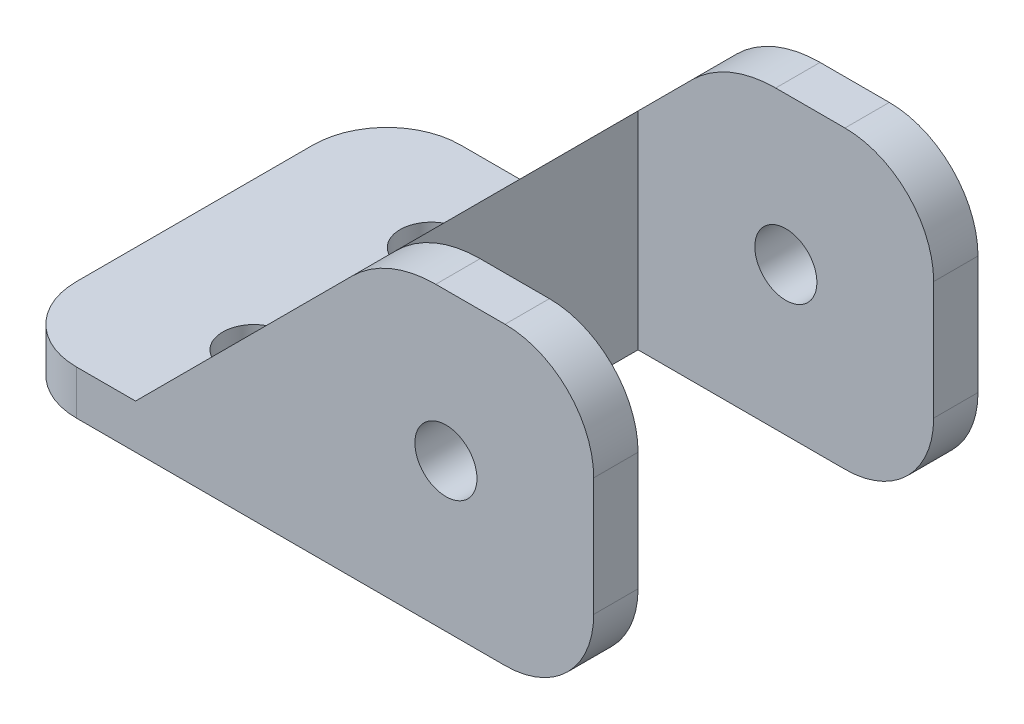
ISO-10303-21;
HEADER;
FILE_DESCRIPTION(('STEP AP214'),'2;1');
FILE_NAME('part.step','',(''),(''),'','','');
FILE_SCHEMA(('AUTOMOTIVE_DESIGN { 1 0 10303 214 1 1 1 1 }'));
ENDSEC;
DATA;
#1=APPLICATION_CONTEXT('core data for automotive mechanical design processes');
#2=APPLICATION_PROTOCOL_DEFINITION('international standard','automotive_design',2000,#1);
#3=PRODUCT_CONTEXT('',#1,'mechanical');
#4=PRODUCT('Part','Part','',(#3));
#5=PRODUCT_RELATED_PRODUCT_CATEGORY('part','',(#4));
#6=PRODUCT_DEFINITION_FORMATION('','',#4);
#7=PRODUCT_DEFINITION_CONTEXT('part definition',#1,'design');
#8=PRODUCT_DEFINITION('design','',#6,#7);
#9=PRODUCT_DEFINITION_SHAPE('','',#8);
#10=(LENGTH_UNIT() NAMED_UNIT(*) SI_UNIT(.MILLI.,.METRE.));
#11=(NAMED_UNIT(*) PLANE_ANGLE_UNIT() SI_UNIT($,.RADIAN.));
#12=(NAMED_UNIT(*) SI_UNIT($,.STERADIAN.) SOLID_ANGLE_UNIT());
#13=UNCERTAINTY_MEASURE_WITH_UNIT(LENGTH_MEASURE(1.E-05),#10,'distance_accuracy_value','');
#14=(GEOMETRIC_REPRESENTATION_CONTEXT(3) GLOBAL_UNCERTAINTY_ASSIGNED_CONTEXT((#13)) GLOBAL_UNIT_ASSIGNED_CONTEXT((#10,
#11,#12)) REPRESENTATION_CONTEXT('',''));
#15=CARTESIAN_POINT('',(0.,0.,0.));
#16=DIRECTION('',(0.,0.,1.));
#17=DIRECTION('',(1.,0.,0.));
#18=AXIS2_PLACEMENT_3D('',#15,#16,#17);
#19=CARTESIAN_POINT('',(6.00000000000001,20.,0.));
#20=DIRECTION('',(-0.707106781186549,0.707106781186546,0.));
#21=DIRECTION('',(0.,0.,-1.));
#22=AXIS2_PLACEMENT_3D('',#19,#20,#21);
#23=PLANE('',#22);
#24=DIRECTION('',(0.,0.,-1.));
#25=VECTOR('',#24,1.);
#26=CARTESIAN_POINT('',(-11.0000000000001,3.,0.));
#27=LINE('',#26,#25);
#28=CARTESIAN_POINT('',(-11.0000000000001,3.,-22.8729833462074));
#29=VERTEX_POINT('',#28);
#30=CARTESIAN_POINT('',(-11.0000000000001,3.,-26.));
#31=VERTEX_POINT('',#30);
#32=EDGE_CURVE('E203',#29,#31,#27,.T.);
#33=ORIENTED_EDGE('',*,*,#32,.F.);
#34=CARTESIAN_POINT('',(-10.,3.99999999999994,-19.));
#35=DIRECTION('',(-0.707106781186549,0.707106781186546,0.));
#36=DIRECTION('',(-0.707106781186546,-0.707106781186549,0.));
#37=AXIS2_PLACEMENT_3D('',#34,#35,#36);
#38=ELLIPSE('',#37,5.65685424949239,4.);
#39=CARTESIAN_POINT('',(-10.9999999999999,3.,-15.1270166537926));
#40=VERTEX_POINT('',#39);
#41=EDGE_CURVE('E11',#29,#40,#38,.F.);
#42=ORIENTED_EDGE('',*,*,#41,.T.);
#43=CARTESIAN_POINT('',(-11.0000000000001,3.,-10.8729833462074));
#44=VERTEX_POINT('',#43);
#45=EDGE_CURVE('E194',#44,#40,#27,.T.);
#46=ORIENTED_EDGE('',*,*,#45,.F.);
#47=CARTESIAN_POINT('',(-10.,3.99999999999994,-7.));
#48=DIRECTION('',(-0.707106781186549,0.707106781186546,0.));
#49=DIRECTION('',(-0.707106781186546,-0.707106781186549,0.));
#50=AXIS2_PLACEMENT_3D('',#47,#48,#49);
#51=ELLIPSE('',#50,5.65685424949239,4.);
#52=CARTESIAN_POINT('',(-10.9999999999999,3.,-3.12701665379257));
#53=VERTEX_POINT('',#52);
#54=EDGE_CURVE('E53',#44,#53,#51,.F.);
#55=ORIENTED_EDGE('',*,*,#54,.T.);
#56=CARTESIAN_POINT('',(-11.0000000000001,3.,0.));
#57=VERTEX_POINT('',#56);
#58=EDGE_CURVE('E193',#57,#53,#27,.T.);
#59=ORIENTED_EDGE('',*,*,#58,.F.);
#60=DIRECTION('',(-0.707106781186546,-0.707106781186549,0.));
#61=VECTOR('',#60,1.);
#62=CARTESIAN_POINT('',(6.00000000000001,20.,0.));
#63=LINE('',#62,#61);
#64=CARTESIAN_POINT('',(3.65685424949238,17.6568542494924,0.));
#65=VERTEX_POINT('',#64);
#66=EDGE_CURVE('E255',#65,#57,#63,.T.);
#67=ORIENTED_EDGE('',*,*,#66,.F.);
#68=DIRECTION('',(0.,0.,1.));
#69=VECTOR('',#68,1.);
#70=CARTESIAN_POINT('',(3.65685424949238,17.6568542494924,0.));
#71=LINE('',#70,#69);
#72=CARTESIAN_POINT('',(3.65685424949238,17.6568542494924,-3.));
#73=VERTEX_POINT('',#72);
#74=EDGE_CURVE('E239',#65,#73,#71,.F.);
#75=ORIENTED_EDGE('',*,*,#74,.T.);
#76=DIRECTION('',(0.707106781186546,0.707106781186549,0.));
#77=VECTOR('',#76,1.);
#78=CARTESIAN_POINT('',(6.00000000000001,20.,-3.));
#79=LINE('',#78,#77);
#80=CARTESIAN_POINT('',(0.,14.,-3.));
#81=VERTEX_POINT('',#80);
#82=EDGE_CURVE('E252',#81,#73,#79,.T.);
#83=ORIENTED_EDGE('',*,*,#82,.F.);
#84=DIRECTION('',(0.,0.,-1.));
#85=VECTOR('',#84,1.);
#86=CARTESIAN_POINT('',(0.,14.,0.));
#87=LINE('',#86,#85);
#88=CARTESIAN_POINT('',(0.,14.,-23.));
#89=VERTEX_POINT('',#88);
#90=EDGE_CURVE('E201',#81,#89,#87,.T.);
#91=ORIENTED_EDGE('',*,*,#90,.T.);
#92=DIRECTION('',(0.707106781186546,0.707106781186549,0.));
#93=VECTOR('',#92,1.);
#94=CARTESIAN_POINT('',(6.,20.,-23.));
#95=LINE('',#94,#93);
#96=CARTESIAN_POINT('',(3.65685424949238,17.6568542494924,-23.));
#97=VERTEX_POINT('',#96);
#98=EDGE_CURVE('E249',#97,#89,#95,.F.);
#99=ORIENTED_EDGE('',*,*,#98,.F.);
#100=DIRECTION('',(0.,0.,1.));
#101=VECTOR('',#100,1.);
#102=CARTESIAN_POINT('',(3.65685424949238,17.6568542494924,-26.));
#103=LINE('',#102,#101);
#104=CARTESIAN_POINT('',(3.65685424949238,17.6568542494924,-26.));
#105=VERTEX_POINT('',#104);
#106=EDGE_CURVE('E230',#97,#105,#103,.F.);
#107=ORIENTED_EDGE('',*,*,#106,.T.);
#108=DIRECTION('',(-0.707106781186546,-0.707106781186549,0.));
#109=VECTOR('',#108,1.);
#110=CARTESIAN_POINT('',(6.,20.,-26.));
#111=LINE('',#110,#109);
#112=EDGE_CURVE('E246',#31,#105,#111,.F.);
#113=ORIENTED_EDGE('',*,*,#112,.F.);
#114=EDGE_LOOP('',(#33,#42,#46,#55,#59,#67,#75,#83,#91,#99,#107,#113));
#115=FACE_BOUND('',#114,.T.);
#116=ADVANCED_FACE('F45',(#115),#23,.T.);
#117=CARTESIAN_POINT('',(0.,3.,0.));
#118=DIRECTION('',(-1.,0.,0.));
#119=DIRECTION('',(0.,0.,1.));
#120=AXIS2_PLACEMENT_3D('',#117,#118,#119);
#121=PLANE('',#120);
#122=DIRECTION('',(0.,-1.,0.));
#123=VECTOR('',#122,1.);
#124=CARTESIAN_POINT('',(0.,20.,-3.));
#125=LINE('',#124,#123);
#126=CARTESIAN_POINT('',(0.,0.,-3.));
#127=VERTEX_POINT('',#126);
#128=EDGE_CURVE('E364',#81,#127,#125,.T.);
#129=ORIENTED_EDGE('',*,*,#128,.T.);
#130=DIRECTION('',(0.,0.,-1.));
#131=VECTOR('',#130,1.);
#132=CARTESIAN_POINT('',(0.,0.,0.));
#133=LINE('',#132,#131);
#134=CARTESIAN_POINT('',(0.,0.,-23.));
#135=VERTEX_POINT('',#134);
#136=EDGE_CURVE('E320',#127,#135,#133,.T.);
#137=ORIENTED_EDGE('',*,*,#136,.T.);
#138=DIRECTION('',(0.,-1.,0.));
#139=VECTOR('',#138,1.);
#140=CARTESIAN_POINT('',(0.,20.,-23.));
#141=LINE('',#140,#139);
#142=EDGE_CURVE('E295',#89,#135,#141,.T.);
#143=ORIENTED_EDGE('',*,*,#142,.F.);
#144=ORIENTED_EDGE('',*,*,#90,.F.);
#145=EDGE_LOOP('',(#129,#137,#143,#144));
#146=FACE_BOUND('',#145,.T.);
#147=ADVANCED_FACE('F393',(#146),#121,.F.);
#148=CARTESIAN_POINT('',(-15.,3.,-21.));
#149=DIRECTION('',(0.,1.,0.));
#150=DIRECTION('',(0.,0.,1.));
#151=AXIS2_PLACEMENT_3D('',#148,#149,#150);
#152=PLANE('',#151);
#153=ORIENTED_EDGE('',*,*,#45,.T.);
#154=CARTESIAN_POINT('',(-10.,3.,-19.));
#155=DIRECTION('',(0.,1.,0.));
#156=DIRECTION('',(0.,0.,1.));
#157=AXIS2_PLACEMENT_3D('',#154,#155,#156);
#158=CIRCLE('',#157,4.);
#159=EDGE_CURVE('E66',#40,#29,#158,.T.);
#160=ORIENTED_EDGE('',*,*,#159,.T.);
#161=ORIENTED_EDGE('',*,*,#32,.T.);
#162=DIRECTION('',(-1.,0.,0.));
#163=VECTOR('',#162,1.);
#164=CARTESIAN_POINT('',(0.,3.,-26.));
#165=LINE('',#164,#163);
#166=CARTESIAN_POINT('',(-15.,3.,-26.));
#167=VERTEX_POINT('',#166);
#168=EDGE_CURVE('E311',#31,#167,#165,.T.);
#169=ORIENTED_EDGE('',*,*,#168,.T.);
#170=CARTESIAN_POINT('',(-15.,3.,-21.));
#171=DIRECTION('',(0.,1.,0.));
#172=DIRECTION('',(0.,0.,1.));
#173=AXIS2_PLACEMENT_3D('',#170,#171,#172);
#174=CIRCLE('',#173,5.);
#175=CARTESIAN_POINT('',(-20.,3.,-21.));
#176=VERTEX_POINT('',#175);
#177=EDGE_CURVE('E328',#167,#176,#174,.T.);
#178=ORIENTED_EDGE('',*,*,#177,.T.);
#179=DIRECTION('',(0.,0.,1.));
#180=VECTOR('',#179,1.);
#181=CARTESIAN_POINT('',(-20.,3.,-5.00000000000003));
#182=LINE('',#181,#180);
#183=CARTESIAN_POINT('',(-20.,3.,-5.00000000000003));
#184=VERTEX_POINT('',#183);
#185=EDGE_CURVE('E326',#176,#184,#182,.T.);
#186=ORIENTED_EDGE('',*,*,#185,.T.);
#187=CARTESIAN_POINT('',(-15.,3.,-5.));
#188=DIRECTION('',(0.,1.,0.));
#189=DIRECTION('',(0.,0.,-1.));
#190=AXIS2_PLACEMENT_3D('',#187,#188,#189);
#191=CIRCLE('',#190,5.);
#192=CARTESIAN_POINT('',(-15.,3.,0.));
#193=VERTEX_POINT('',#192);
#194=EDGE_CURVE('E324',#184,#193,#191,.T.);
#195=ORIENTED_EDGE('',*,*,#194,.T.);
#196=DIRECTION('',(1.,0.,0.));
#197=VECTOR('',#196,1.);
#198=CARTESIAN_POINT('',(0.,3.,0.));
#199=LINE('',#198,#197);
#200=EDGE_CURVE('E200',#193,#57,#199,.T.);
#201=ORIENTED_EDGE('',*,*,#200,.T.);
#202=ORIENTED_EDGE('',*,*,#58,.T.);
#203=CARTESIAN_POINT('',(-10.,3.,-7.));
#204=DIRECTION('',(0.,1.,0.));
#205=DIRECTION('',(0.,0.,1.));
#206=AXIS2_PLACEMENT_3D('',#203,#204,#205);
#207=CIRCLE('',#206,4.);
#208=EDGE_CURVE('E60',#53,#44,#207,.T.);
#209=ORIENTED_EDGE('',*,*,#208,.T.);
#210=EDGE_LOOP('',(#153,#160,#161,#169,#178,#186,#195,#201,#202,#209));
#211=FACE_BOUND('',#210,.T.);
#212=CARTESIAN_POINT('',(-10.,3.,-7.));
#213=DIRECTION('',(0.,1.,0.));
#214=DIRECTION('',(0.,0.,1.));
#215=AXIS2_PLACEMENT_3D('',#212,#213,#214);
#216=CIRCLE('',#215,2.1);
#217=CARTESIAN_POINT('',(-10.,3.,-4.9));
#218=VERTEX_POINT('',#217);
#219=EDGE_CURVE('E334',#218,#218,#216,.T.);
#220=ORIENTED_EDGE('',*,*,#219,.F.);
#221=EDGE_LOOP('',(#220));
#222=FACE_BOUND('',#221,.T.);
#223=CARTESIAN_POINT('',(-10.,3.,-19.));
#224=DIRECTION('',(0.,1.,0.));
#225=DIRECTION('',(0.,0.,1.));
#226=AXIS2_PLACEMENT_3D('',#223,#224,#225);
#227=CIRCLE('',#226,2.1);
#228=CARTESIAN_POINT('',(-10.,3.,-16.9));
#229=VERTEX_POINT('',#228);
#230=EDGE_CURVE('E322',#229,#229,#227,.T.);
#231=ORIENTED_EDGE('',*,*,#230,.F.);
#232=EDGE_LOOP('',(#231));
#233=FACE_BOUND('',#232,.T.);
#234=ADVANCED_FACE('F197',(#211,#222,#233),#152,.T.);
#235=CARTESIAN_POINT('',(-15.,0.,-21.));
#236=DIRECTION('',(0.,1.,0.));
#237=DIRECTION('',(0.,0.,1.));
#238=AXIS2_PLACEMENT_3D('',#235,#236,#237);
#239=PLANE('',#238);
#240=DIRECTION('',(-1.,0.,0.));
#241=VECTOR('',#240,1.);
#242=CARTESIAN_POINT('',(20.,0.,-3.));
#243=LINE('',#242,#241);
#244=CARTESIAN_POINT('',(14.,0.,-3.));
#245=VERTEX_POINT('',#244);
#246=EDGE_CURVE('E355',#245,#127,#243,.T.);
#247=ORIENTED_EDGE('',*,*,#246,.F.);
#248=DIRECTION('',(0.,0.,-1.));
#249=VECTOR('',#248,1.);
#250=CARTESIAN_POINT('',(14.,0.,-21.));
#251=LINE('',#250,#249);
#252=CARTESIAN_POINT('',(14.,0.,0.));
#253=VERTEX_POINT('',#252);
#254=EDGE_CURVE('E274',#245,#253,#251,.F.);
#255=ORIENTED_EDGE('',*,*,#254,.T.);
#256=DIRECTION('',(1.,0.,0.));
#257=VECTOR('',#256,1.);
#258=CARTESIAN_POINT('',(0.,0.,0.));
#259=LINE('',#258,#257);
#260=CARTESIAN_POINT('',(-15.,0.,0.));
#261=VERTEX_POINT('',#260);
#262=EDGE_CURVE('E308',#261,#253,#259,.T.);
#263=ORIENTED_EDGE('',*,*,#262,.F.);
#264=CARTESIAN_POINT('',(-15.,0.,-5.));
#265=DIRECTION('',(0.,1.,0.));
#266=DIRECTION('',(0.,0.,-1.));
#267=AXIS2_PLACEMENT_3D('',#264,#265,#266);
#268=CIRCLE('',#267,5.);
#269=CARTESIAN_POINT('',(-20.,0.,-5.00000000000003));
#270=VERTEX_POINT('',#269);
#271=EDGE_CURVE('E312',#270,#261,#268,.T.);
#272=ORIENTED_EDGE('',*,*,#271,.F.);
#273=DIRECTION('',(0.,0.,1.));
#274=VECTOR('',#273,1.);
#275=CARTESIAN_POINT('',(-20.,0.,-5.00000000000003));
#276=LINE('',#275,#274);
#277=CARTESIAN_POINT('',(-20.,0.,-21.));
#278=VERTEX_POINT('',#277);
#279=EDGE_CURVE('E314',#278,#270,#276,.T.);
#280=ORIENTED_EDGE('',*,*,#279,.F.);
#281=CARTESIAN_POINT('',(-15.,0.,-21.));
#282=DIRECTION('',(0.,1.,0.));
#283=DIRECTION('',(0.,0.,1.));
#284=AXIS2_PLACEMENT_3D('',#281,#282,#283);
#285=CIRCLE('',#284,5.);
#286=CARTESIAN_POINT('',(-15.,0.,-26.));
#287=VERTEX_POINT('',#286);
#288=EDGE_CURVE('E316',#287,#278,#285,.T.);
#289=ORIENTED_EDGE('',*,*,#288,.F.);
#290=DIRECTION('',(-1.,0.,0.));
#291=VECTOR('',#290,1.);
#292=CARTESIAN_POINT('',(0.,0.,-26.));
#293=LINE('',#292,#291);
#294=CARTESIAN_POINT('',(14.,0.,-26.));
#295=VERTEX_POINT('',#294);
#296=EDGE_CURVE('E318',#295,#287,#293,.T.);
#297=ORIENTED_EDGE('',*,*,#296,.F.);
#298=DIRECTION('',(0.,0.,-1.));
#299=VECTOR('',#298,1.);
#300=CARTESIAN_POINT('',(14.,0.,-21.));
#301=LINE('',#300,#299);
#302=CARTESIAN_POINT('',(14.,0.,-23.));
#303=VERTEX_POINT('',#302);
#304=EDGE_CURVE('E276',#295,#303,#301,.F.);
#305=ORIENTED_EDGE('',*,*,#304,.T.);
#306=DIRECTION('',(1.,0.,0.));
#307=VECTOR('',#306,1.);
#308=CARTESIAN_POINT('',(20.,0.,-23.));
#309=LINE('',#308,#307);
#310=EDGE_CURVE('E351',#135,#303,#309,.T.);
#311=ORIENTED_EDGE('',*,*,#310,.F.);
#312=ORIENTED_EDGE('',*,*,#136,.F.);
#313=EDGE_LOOP('',(#247,#255,#263,#272,#280,#289,#297,#305,#311,#312));
#314=FACE_BOUND('',#313,.T.);
#315=CARTESIAN_POINT('',(-10.,0.,-19.));
#316=DIRECTION('',(0.,1.,0.));
#317=DIRECTION('',(0.,0.,1.));
#318=AXIS2_PLACEMENT_3D('',#315,#316,#317);
#319=CIRCLE('',#318,2.1);
#320=CARTESIAN_POINT('',(-10.,0.,-16.9));
#321=VERTEX_POINT('',#320);
#322=EDGE_CURVE('E331',#321,#321,#319,.T.);
#323=ORIENTED_EDGE('',*,*,#322,.T.);
#324=EDGE_LOOP('',(#323));
#325=FACE_BOUND('',#324,.T.);
#326=CARTESIAN_POINT('',(-10.,0.,-7.));
#327=DIRECTION('',(0.,1.,0.));
#328=DIRECTION('',(0.,0.,1.));
#329=AXIS2_PLACEMENT_3D('',#326,#327,#328);
#330=CIRCLE('',#329,2.1);
#331=CARTESIAN_POINT('',(-10.,0.,-4.9));
#332=VERTEX_POINT('',#331);
#333=EDGE_CURVE('E337',#332,#332,#330,.T.);
#334=ORIENTED_EDGE('',*,*,#333,.T.);
#335=EDGE_LOOP('',(#334));
#336=FACE_BOUND('',#335,.T.);
#337=ADVANCED_FACE('F388',(#314,#325,#336),#239,.F.);
#338=CARTESIAN_POINT('',(0.,3.,-26.));
#339=DIRECTION('',(0.,0.,1.));
#340=DIRECTION('',(1.,0.,0.));
#341=AXIS2_PLACEMENT_3D('',#338,#339,#340);
#342=PLANE('',#341);
#343=CARTESIAN_POINT('',(10.,10.,-26.));
#344=DIRECTION('',(0.,0.,1.));
#345=DIRECTION('',(1.,0.,0.));
#346=AXIS2_PLACEMENT_3D('',#343,#344,#345);
#347=CIRCLE('',#346,2.1);
#348=CARTESIAN_POINT('',(12.1,10.,-26.));
#349=VERTEX_POINT('',#348);
#350=EDGE_CURVE('E208',#349,#349,#347,.T.);
#351=ORIENTED_EDGE('',*,*,#350,.T.);
#352=EDGE_LOOP('',(#351));
#353=FACE_BOUND('',#352,.T.);
#354=ORIENTED_EDGE('',*,*,#168,.F.);
#355=ORIENTED_EDGE('',*,*,#112,.T.);
#356=CARTESIAN_POINT('',(9.31370849898478,12.,-26.));
#357=DIRECTION('',(0.,0.,1.));
#358=DIRECTION('',(1.,0.,0.));
#359=AXIS2_PLACEMENT_3D('',#356,#357,#358);
#360=CIRCLE('',#359,8.);
#361=CARTESIAN_POINT('',(9.31370849898478,20.,-26.));
#362=VERTEX_POINT('',#361);
#363=EDGE_CURVE('E195',#105,#362,#360,.F.);
#364=ORIENTED_EDGE('',*,*,#363,.T.);
#365=DIRECTION('',(-1.,0.,0.));
#366=VECTOR('',#365,1.);
#367=CARTESIAN_POINT('',(0.,20.,-26.));
#368=LINE('',#367,#366);
#369=CARTESIAN_POINT('',(14.,20.,-26.));
#370=VERTEX_POINT('',#369);
#371=EDGE_CURVE('E350',#370,#362,#368,.T.);
#372=ORIENTED_EDGE('',*,*,#371,.F.);
#373=CARTESIAN_POINT('',(14.,14.,-26.));
#374=DIRECTION('',(0.,0.,1.));
#375=DIRECTION('',(1.,0.,0.));
#376=AXIS2_PLACEMENT_3D('',#373,#374,#375);
#377=CIRCLE('',#376,6.);
#378=CARTESIAN_POINT('',(20.,14.,-26.));
#379=VERTEX_POINT('',#378);
#380=EDGE_CURVE('E267',#370,#379,#377,.F.);
#381=ORIENTED_EDGE('',*,*,#380,.T.);
#382=DIRECTION('',(0.,-1.,0.));
#383=VECTOR('',#382,1.);
#384=CARTESIAN_POINT('',(20.,20.,-26.));
#385=LINE('',#384,#383);
#386=CARTESIAN_POINT('',(20.,6.,-26.));
#387=VERTEX_POINT('',#386);
#388=EDGE_CURVE('E347',#379,#387,#385,.T.);
#389=ORIENTED_EDGE('',*,*,#388,.T.);
#390=CARTESIAN_POINT('',(14.,6.,-26.));
#391=DIRECTION('',(0.,0.,1.));
#392=DIRECTION('',(1.,0.,0.));
#393=AXIS2_PLACEMENT_3D('',#390,#391,#392);
#394=CIRCLE('',#393,6.);
#395=EDGE_CURVE('E269',#387,#295,#394,.F.);
#396=ORIENTED_EDGE('',*,*,#395,.T.);
#397=ORIENTED_EDGE('',*,*,#296,.T.);
#398=DIRECTION('',(0.,-1.,0.));
#399=VECTOR('',#398,1.);
#400=CARTESIAN_POINT('',(-15.,3.,-26.));
#401=LINE('',#400,#399);
#402=EDGE_CURVE('E296',#167,#287,#401,.T.);
#403=ORIENTED_EDGE('',*,*,#402,.F.);
#404=EDGE_LOOP('',(#354,#355,#364,#372,#381,#389,#396,#397,#403));
#405=FACE_BOUND('',#404,.T.);
#406=ADVANCED_FACE('F464',(#353,#405),#342,.F.);
#407=CARTESIAN_POINT('',(-15.,3.,-21.));
#408=DIRECTION('',(0.,-1.,0.));
#409=DIRECTION('',(0.,0.,-1.));
#410=AXIS2_PLACEMENT_3D('',#407,#408,#409);
#411=CYLINDRICAL_SURFACE('',#410,5.);
#412=ORIENTED_EDGE('',*,*,#288,.T.);
#413=DIRECTION('',(0.,-1.,0.));
#414=VECTOR('',#413,1.);
#415=CARTESIAN_POINT('',(-20.,3.,-21.));
#416=LINE('',#415,#414);
#417=EDGE_CURVE('E299',#176,#278,#416,.T.);
#418=ORIENTED_EDGE('',*,*,#417,.F.);
#419=ORIENTED_EDGE('',*,*,#177,.F.);
#420=ORIENTED_EDGE('',*,*,#402,.T.);
#421=EDGE_LOOP('',(#412,#418,#419,#420));
#422=FACE_BOUND('',#421,.T.);
#423=ADVANCED_FACE('F471',(#422),#411,.T.);
#424=CARTESIAN_POINT('',(-20.,3.,-5.00000000000003));
#425=DIRECTION('',(1.,0.,0.));
#426=DIRECTION('',(0.,0.,-1.));
#427=AXIS2_PLACEMENT_3D('',#424,#425,#426);
#428=PLANE('',#427);
#429=ORIENTED_EDGE('',*,*,#279,.T.);
#430=DIRECTION('',(0.,-1.,0.));
#431=VECTOR('',#430,1.);
#432=CARTESIAN_POINT('',(-20.,3.,-5.00000000000003));
#433=LINE('',#432,#431);
#434=EDGE_CURVE('E302',#184,#270,#433,.T.);
#435=ORIENTED_EDGE('',*,*,#434,.F.);
#436=ORIENTED_EDGE('',*,*,#185,.F.);
#437=ORIENTED_EDGE('',*,*,#417,.T.);
#438=EDGE_LOOP('',(#429,#435,#436,#437));
#439=FACE_BOUND('',#438,.T.);
#440=ADVANCED_FACE('F475',(#439),#428,.F.);
#441=CARTESIAN_POINT('',(-15.,3.,-5.));
#442=DIRECTION('',(0.,-1.,0.));
#443=DIRECTION('',(0.,0.,-1.));
#444=AXIS2_PLACEMENT_3D('',#441,#442,#443);
#445=CYLINDRICAL_SURFACE('',#444,5.);
#446=ORIENTED_EDGE('',*,*,#271,.T.);
#447=DIRECTION('',(0.,-1.,0.));
#448=VECTOR('',#447,1.);
#449=CARTESIAN_POINT('',(-15.,3.,0.));
#450=LINE('',#449,#448);
#451=EDGE_CURVE('E305',#193,#261,#450,.T.);
#452=ORIENTED_EDGE('',*,*,#451,.F.);
#453=ORIENTED_EDGE('',*,*,#194,.F.);
#454=ORIENTED_EDGE('',*,*,#434,.T.);
#455=EDGE_LOOP('',(#446,#452,#453,#454));
#456=FACE_BOUND('',#455,.T.);
#457=ADVANCED_FACE('F480',(#456),#445,.T.);
#458=CARTESIAN_POINT('',(0.,3.,0.));
#459=DIRECTION('',(0.,0.,-1.));
#460=DIRECTION('',(-1.,0.,0.));
#461=AXIS2_PLACEMENT_3D('',#458,#459,#460);
#462=PLANE('',#461);
#463=CARTESIAN_POINT('',(10.,10.,0.));
#464=DIRECTION('',(0.,0.,1.));
#465=DIRECTION('',(1.,0.,0.));
#466=AXIS2_PLACEMENT_3D('',#463,#464,#465);
#467=CIRCLE('',#466,2.1);
#468=CARTESIAN_POINT('',(12.1,10.,0.));
#469=VERTEX_POINT('',#468);
#470=EDGE_CURVE('E219',#469,#469,#467,.T.);
#471=ORIENTED_EDGE('',*,*,#470,.F.);
#472=EDGE_LOOP('',(#471));
#473=FACE_BOUND('',#472,.T.);
#474=ORIENTED_EDGE('',*,*,#66,.T.);
#475=ORIENTED_EDGE('',*,*,#200,.F.);
#476=ORIENTED_EDGE('',*,*,#451,.T.);
#477=ORIENTED_EDGE('',*,*,#262,.T.);
#478=CARTESIAN_POINT('',(14.,6.,0.));
#479=DIRECTION('',(0.,0.,-1.));
#480=DIRECTION('',(-1.,0.,0.));
#481=AXIS2_PLACEMENT_3D('',#478,#479,#480);
#482=CIRCLE('',#481,6.);
#483=CARTESIAN_POINT('',(20.,6.,0.));
#484=VERTEX_POINT('',#483);
#485=EDGE_CURVE('E281',#253,#484,#482,.F.);
#486=ORIENTED_EDGE('',*,*,#485,.T.);
#487=DIRECTION('',(0.,-1.,0.));
#488=VECTOR('',#487,1.);
#489=CARTESIAN_POINT('',(20.,20.,0.));
#490=LINE('',#489,#488);
#491=CARTESIAN_POINT('',(20.,14.,0.));
#492=VERTEX_POINT('',#491);
#493=EDGE_CURVE('E205',#492,#484,#490,.T.);
#494=ORIENTED_EDGE('',*,*,#493,.F.);
#495=CARTESIAN_POINT('',(14.,14.,0.));
#496=DIRECTION('',(0.,0.,-1.));
#497=DIRECTION('',(-1.,0.,0.));
#498=AXIS2_PLACEMENT_3D('',#495,#496,#497);
#499=CIRCLE('',#498,6.);
#500=CARTESIAN_POINT('',(14.,20.,0.));
#501=VERTEX_POINT('',#500);
#502=EDGE_CURVE('E278',#492,#501,#499,.F.);
#503=ORIENTED_EDGE('',*,*,#502,.T.);
#504=DIRECTION('',(1.,0.,0.));
#505=VECTOR('',#504,1.);
#506=CARTESIAN_POINT('',(0.,20.,0.));
#507=LINE('',#506,#505);
#508=CARTESIAN_POINT('',(9.31370849898478,20.,0.));
#509=VERTEX_POINT('',#508);
#510=EDGE_CURVE('E359',#509,#501,#507,.T.);
#511=ORIENTED_EDGE('',*,*,#510,.F.);
#512=CARTESIAN_POINT('',(9.31370849898478,12.,0.));
#513=DIRECTION('',(0.,0.,-1.));
#514=DIRECTION('',(-1.,0.,0.));
#515=AXIS2_PLACEMENT_3D('',#512,#513,#514);
#516=CIRCLE('',#515,8.);
#517=EDGE_CURVE('E241',#509,#65,#516,.F.);
#518=ORIENTED_EDGE('',*,*,#517,.T.);
#519=EDGE_LOOP('',(#474,#475,#476,#477,#486,#494,#503,#511,#518));
#520=FACE_BOUND('',#519,.T.);
#521=ADVANCED_FACE('F411',(#473,#520),#462,.F.);
#522=CARTESIAN_POINT('',(-10.,3.,-19.));
#523=DIRECTION('',(0.,-1.,0.));
#524=DIRECTION('',(0.,0.,-1.));
#525=AXIS2_PLACEMENT_3D('',#522,#523,#524);
#526=CYLINDRICAL_SURFACE('',#525,2.1);
#527=ORIENTED_EDGE('',*,*,#230,.T.);
#528=EDGE_LOOP('',(#527));
#529=FACE_BOUND('',#528,.T.);
#530=ORIENTED_EDGE('',*,*,#322,.F.);
#531=EDGE_LOOP('',(#530));
#532=FACE_BOUND('',#531,.T.);
#533=ADVANCED_FACE('F488',(#529,#532),#526,.F.);
#534=CARTESIAN_POINT('',(-10.,3.,-7.));
#535=DIRECTION('',(0.,-1.,0.));
#536=DIRECTION('',(0.,0.,-1.));
#537=AXIS2_PLACEMENT_3D('',#534,#535,#536);
#538=CYLINDRICAL_SURFACE('',#537,2.1);
#539=ORIENTED_EDGE('',*,*,#219,.T.);
#540=EDGE_LOOP('',(#539));
#541=FACE_BOUND('',#540,.T.);
#542=ORIENTED_EDGE('',*,*,#333,.F.);
#543=EDGE_LOOP('',(#542));
#544=FACE_BOUND('',#543,.T.);
#545=ADVANCED_FACE('F507',(#541,#544),#538,.F.);
#546=CARTESIAN_POINT('',(20.,20.,-23.));
#547=DIRECTION('',(0.,0.,-1.));
#548=DIRECTION('',(-1.,0.,0.));
#549=AXIS2_PLACEMENT_3D('',#546,#547,#548);
#550=PLANE('',#549);
#551=CARTESIAN_POINT('',(10.,10.,-23.));
#552=DIRECTION('',(0.,0.,-1.));
#553=DIRECTION('',(-1.,0.,0.));
#554=AXIS2_PLACEMENT_3D('',#551,#552,#553);
#555=CIRCLE('',#554,2.1);
#556=CARTESIAN_POINT('',(7.9,10.,-23.));
#557=VERTEX_POINT('',#556);
#558=EDGE_CURVE('E211',#557,#557,#555,.T.);
#559=ORIENTED_EDGE('',*,*,#558,.T.);
#560=EDGE_LOOP('',(#559));
#561=FACE_BOUND('',#560,.T.);
#562=DIRECTION('',(1.,0.,0.));
#563=VECTOR('',#562,1.);
#564=CARTESIAN_POINT('',(20.,20.,-23.));
#565=LINE('',#564,#563);
#566=CARTESIAN_POINT('',(9.31370849898478,20.,-23.));
#567=VERTEX_POINT('',#566);
#568=CARTESIAN_POINT('',(14.,20.,-23.));
#569=VERTEX_POINT('',#568);
#570=EDGE_CURVE('E354',#567,#569,#565,.T.);
#571=ORIENTED_EDGE('',*,*,#570,.F.);
#572=CARTESIAN_POINT('',(9.31370849898478,12.,-23.));
#573=DIRECTION('',(0.,0.,-1.));
#574=DIRECTION('',(-1.,0.,0.));
#575=AXIS2_PLACEMENT_3D('',#572,#573,#574);
#576=CIRCLE('',#575,8.);
#577=EDGE_CURVE('E232',#567,#97,#576,.F.);
#578=ORIENTED_EDGE('',*,*,#577,.T.);
#579=ORIENTED_EDGE('',*,*,#98,.T.);
#580=ORIENTED_EDGE('',*,*,#142,.T.);
#581=ORIENTED_EDGE('',*,*,#310,.T.);
#582=CARTESIAN_POINT('',(14.,6.,-23.));
#583=DIRECTION('',(0.,0.,-1.));
#584=DIRECTION('',(-1.,0.,0.));
#585=AXIS2_PLACEMENT_3D('',#582,#583,#584);
#586=CIRCLE('',#585,6.);
#587=CARTESIAN_POINT('',(20.,6.,-23.));
#588=VERTEX_POINT('',#587);
#589=EDGE_CURVE('E260',#303,#588,#586,.F.);
#590=ORIENTED_EDGE('',*,*,#589,.T.);
#591=DIRECTION('',(0.,-1.,0.));
#592=VECTOR('',#591,1.);
#593=CARTESIAN_POINT('',(20.,20.,-23.));
#594=LINE('',#593,#592);
#595=CARTESIAN_POINT('',(20.,14.,-23.));
#596=VERTEX_POINT('',#595);
#597=EDGE_CURVE('E340',#596,#588,#594,.T.);
#598=ORIENTED_EDGE('',*,*,#597,.F.);
#599=CARTESIAN_POINT('',(14.,14.,-23.));
#600=DIRECTION('',(0.,0.,-1.));
#601=DIRECTION('',(-1.,0.,0.));
#602=AXIS2_PLACEMENT_3D('',#599,#600,#601);
#603=CIRCLE('',#602,6.);
#604=EDGE_CURVE('E257',#596,#569,#603,.F.);
#605=ORIENTED_EDGE('',*,*,#604,.T.);
#606=EDGE_LOOP('',(#571,#578,#579,#580,#581,#590,#598,#605));
#607=FACE_BOUND('',#606,.T.);
#608=ADVANCED_FACE('F397',(#561,#607),#550,.F.);
#609=CARTESIAN_POINT('',(20.,20.,-26.));
#610=DIRECTION('',(-1.,0.,0.));
#611=DIRECTION('',(0.,0.,1.));
#612=AXIS2_PLACEMENT_3D('',#609,#610,#611);
#613=PLANE('',#612);
#614=ORIENTED_EDGE('',*,*,#388,.F.);
#615=DIRECTION('',(0.,0.,-1.));
#616=VECTOR('',#615,1.);
#617=CARTESIAN_POINT('',(20.,14.,-26.));
#618=LINE('',#617,#616);
#619=EDGE_CURVE('E262',#379,#596,#618,.F.);
#620=ORIENTED_EDGE('',*,*,#619,.T.);
#621=ORIENTED_EDGE('',*,*,#597,.T.);
#622=DIRECTION('',(0.,0.,-1.));
#623=VECTOR('',#622,1.);
#624=CARTESIAN_POINT('',(20.,6.,-26.));
#625=LINE('',#624,#623);
#626=EDGE_CURVE('E264',#588,#387,#625,.T.);
#627=ORIENTED_EDGE('',*,*,#626,.T.);
#628=EDGE_LOOP('',(#614,#620,#621,#627));
#629=FACE_BOUND('',#628,.T.);
#630=ADVANCED_FACE('F454',(#629),#613,.F.);
#631=CARTESIAN_POINT('',(0.,20.,0.));
#632=DIRECTION('',(0.,-1.,0.));
#633=DIRECTION('',(0.,0.,-1.));
#634=AXIS2_PLACEMENT_3D('',#631,#632,#633);
#635=PLANE('',#634);
#636=ORIENTED_EDGE('',*,*,#371,.T.);
#637=DIRECTION('',(0.,0.,-1.));
#638=VECTOR('',#637,1.);
#639=CARTESIAN_POINT('',(9.31370849898478,20.,-23.));
#640=LINE('',#639,#638);
#641=EDGE_CURVE('E234',#362,#567,#640,.F.);
#642=ORIENTED_EDGE('',*,*,#641,.T.);
#643=ORIENTED_EDGE('',*,*,#570,.T.);
#644=DIRECTION('',(0.,0.,-1.));
#645=VECTOR('',#644,1.);
#646=CARTESIAN_POINT('',(14.,20.,0.));
#647=LINE('',#646,#645);
#648=EDGE_CURVE('E271',#569,#370,#647,.T.);
#649=ORIENTED_EDGE('',*,*,#648,.T.);
#650=EDGE_LOOP('',(#636,#642,#643,#649));
#651=FACE_BOUND('',#650,.T.);
#652=ADVANCED_FACE('F458',(#651),#635,.F.);
#653=CARTESIAN_POINT('',(20.,20.,0.));
#654=DIRECTION('',(-1.,0.,0.));
#655=DIRECTION('',(0.,0.,1.));
#656=AXIS2_PLACEMENT_3D('',#653,#654,#655);
#657=PLANE('',#656);
#658=DIRECTION('',(0.,-1.,0.));
#659=VECTOR('',#658,1.);
#660=CARTESIAN_POINT('',(20.,20.,-3.));
#661=LINE('',#660,#659);
#662=CARTESIAN_POINT('',(20.,14.,-3.));
#663=VERTEX_POINT('',#662);
#664=CARTESIAN_POINT('',(20.,6.,-3.));
#665=VERTEX_POINT('',#664);
#666=EDGE_CURVE('E368',#663,#665,#661,.T.);
#667=ORIENTED_EDGE('',*,*,#666,.F.);
#668=DIRECTION('',(0.,0.,-1.));
#669=VECTOR('',#668,1.);
#670=CARTESIAN_POINT('',(20.,14.,0.));
#671=LINE('',#670,#669);
#672=EDGE_CURVE('E283',#663,#492,#671,.F.);
#673=ORIENTED_EDGE('',*,*,#672,.T.);
#674=ORIENTED_EDGE('',*,*,#493,.T.);
#675=DIRECTION('',(0.,0.,-1.));
#676=VECTOR('',#675,1.);
#677=CARTESIAN_POINT('',(20.,6.,0.));
#678=LINE('',#677,#676);
#679=EDGE_CURVE('E285',#484,#665,#678,.T.);
#680=ORIENTED_EDGE('',*,*,#679,.T.);
#681=EDGE_LOOP('',(#667,#673,#674,#680));
#682=FACE_BOUND('',#681,.T.);
#683=ADVANCED_FACE('F375',(#682),#657,.F.);
#684=CARTESIAN_POINT('',(20.,20.,-3.));
#685=DIRECTION('',(0.,0.,1.));
#686=DIRECTION('',(1.,0.,0.));
#687=AXIS2_PLACEMENT_3D('',#684,#685,#686);
#688=PLANE('',#687);
#689=CARTESIAN_POINT('',(10.,10.,-3.));
#690=DIRECTION('',(0.,0.,1.));
#691=DIRECTION('',(1.,0.,0.));
#692=AXIS2_PLACEMENT_3D('',#689,#690,#691);
#693=CIRCLE('',#692,2.1);
#694=CARTESIAN_POINT('',(12.1,10.,-3.));
#695=VERTEX_POINT('',#694);
#696=EDGE_CURVE('E216',#695,#695,#693,.T.);
#697=ORIENTED_EDGE('',*,*,#696,.T.);
#698=EDGE_LOOP('',(#697));
#699=FACE_BOUND('',#698,.T.);
#700=ORIENTED_EDGE('',*,*,#82,.T.);
#701=CARTESIAN_POINT('',(9.31370849898478,12.,-3.));
#702=DIRECTION('',(0.,0.,1.));
#703=DIRECTION('',(1.,0.,0.));
#704=AXIS2_PLACEMENT_3D('',#701,#702,#703);
#705=CIRCLE('',#704,8.);
#706=CARTESIAN_POINT('',(9.31370849898478,20.,-3.));
#707=VERTEX_POINT('',#706);
#708=EDGE_CURVE('E237',#73,#707,#705,.F.);
#709=ORIENTED_EDGE('',*,*,#708,.T.);
#710=DIRECTION('',(-1.,0.,0.));
#711=VECTOR('',#710,1.);
#712=CARTESIAN_POINT('',(20.,20.,-3.));
#713=LINE('',#712,#711);
#714=CARTESIAN_POINT('',(14.,20.,-3.));
#715=VERTEX_POINT('',#714);
#716=EDGE_CURVE('E361',#715,#707,#713,.T.);
#717=ORIENTED_EDGE('',*,*,#716,.F.);
#718=CARTESIAN_POINT('',(14.,14.,-3.));
#719=DIRECTION('',(0.,0.,1.));
#720=DIRECTION('',(1.,0.,0.));
#721=AXIS2_PLACEMENT_3D('',#718,#719,#720);
#722=CIRCLE('',#721,6.);
#723=EDGE_CURVE('E288',#715,#663,#722,.F.);
#724=ORIENTED_EDGE('',*,*,#723,.T.);
#725=ORIENTED_EDGE('',*,*,#666,.T.);
#726=CARTESIAN_POINT('',(14.,6.,-3.));
#727=DIRECTION('',(0.,0.,1.));
#728=DIRECTION('',(1.,0.,0.));
#729=AXIS2_PLACEMENT_3D('',#726,#727,#728);
#730=CIRCLE('',#729,6.);
#731=EDGE_CURVE('E290',#665,#245,#730,.F.);
#732=ORIENTED_EDGE('',*,*,#731,.T.);
#733=ORIENTED_EDGE('',*,*,#246,.T.);
#734=ORIENTED_EDGE('',*,*,#128,.F.);
#735=EDGE_LOOP('',(#700,#709,#717,#724,#725,#732,#733,#734));
#736=FACE_BOUND('',#735,.T.);
#737=ADVANCED_FACE('F385',(#699,#736),#688,.F.);
#738=CARTESIAN_POINT('',(0.,20.,0.));
#739=DIRECTION('',(0.,1.,0.));
#740=DIRECTION('',(0.,0.,1.));
#741=AXIS2_PLACEMENT_3D('',#738,#739,#740);
#742=PLANE('',#741);
#743=ORIENTED_EDGE('',*,*,#716,.T.);
#744=DIRECTION('',(0.,0.,1.));
#745=VECTOR('',#744,1.);
#746=CARTESIAN_POINT('',(9.31370849898478,20.,0.));
#747=LINE('',#746,#745);
#748=EDGE_CURVE('E243',#707,#509,#747,.T.);
#749=ORIENTED_EDGE('',*,*,#748,.T.);
#750=ORIENTED_EDGE('',*,*,#510,.T.);
#751=DIRECTION('',(0.,0.,-1.));
#752=VECTOR('',#751,1.);
#753=CARTESIAN_POINT('',(14.,20.,-3.));
#754=LINE('',#753,#752);
#755=EDGE_CURVE('E292',#501,#715,#754,.T.);
#756=ORIENTED_EDGE('',*,*,#755,.T.);
#757=EDGE_LOOP('',(#743,#749,#750,#756));
#758=FACE_BOUND('',#757,.T.);
#759=ADVANCED_FACE('F410',(#758),#742,.T.);
#760=CARTESIAN_POINT('',(14.,14.,0.));
#761=DIRECTION('',(0.,0.,1.));
#762=DIRECTION('',(1.,0.,0.));
#763=AXIS2_PLACEMENT_3D('',#760,#761,#762);
#764=CYLINDRICAL_SURFACE('',#763,6.);
#765=ORIENTED_EDGE('',*,*,#502,.F.);
#766=ORIENTED_EDGE('',*,*,#672,.F.);
#767=ORIENTED_EDGE('',*,*,#723,.F.);
#768=ORIENTED_EDGE('',*,*,#755,.F.);
#769=EDGE_LOOP('',(#765,#766,#767,#768));
#770=FACE_BOUND('',#769,.T.);
#771=ADVANCED_FACE('F414',(#770),#764,.T.);
#772=CARTESIAN_POINT('',(14.,6.,0.));
#773=DIRECTION('',(0.,0.,-1.));
#774=DIRECTION('',(-1.,0.,0.));
#775=AXIS2_PLACEMENT_3D('',#772,#773,#774);
#776=CYLINDRICAL_SURFACE('',#775,6.);
#777=ORIENTED_EDGE('',*,*,#485,.F.);
#778=ORIENTED_EDGE('',*,*,#254,.F.);
#779=ORIENTED_EDGE('',*,*,#731,.F.);
#780=ORIENTED_EDGE('',*,*,#679,.F.);
#781=EDGE_LOOP('',(#777,#778,#779,#780));
#782=FACE_BOUND('',#781,.T.);
#783=ADVANCED_FACE('F381',(#782),#776,.T.);
#784=CARTESIAN_POINT('',(14.,14.,0.));
#785=DIRECTION('',(0.,0.,-1.));
#786=DIRECTION('',(-1.,0.,0.));
#787=AXIS2_PLACEMENT_3D('',#784,#785,#786);
#788=CYLINDRICAL_SURFACE('',#787,6.);
#789=ORIENTED_EDGE('',*,*,#604,.F.);
#790=ORIENTED_EDGE('',*,*,#619,.F.);
#791=ORIENTED_EDGE('',*,*,#380,.F.);
#792=ORIENTED_EDGE('',*,*,#648,.F.);
#793=EDGE_LOOP('',(#789,#790,#791,#792));
#794=FACE_BOUND('',#793,.T.);
#795=ADVANCED_FACE('F421',(#794),#788,.T.);
#796=CARTESIAN_POINT('',(14.,6.,-26.));
#797=DIRECTION('',(0.,0.,-1.));
#798=DIRECTION('',(-1.,0.,0.));
#799=AXIS2_PLACEMENT_3D('',#796,#797,#798);
#800=CYLINDRICAL_SURFACE('',#799,6.);
#801=ORIENTED_EDGE('',*,*,#589,.F.);
#802=ORIENTED_EDGE('',*,*,#304,.F.);
#803=ORIENTED_EDGE('',*,*,#395,.F.);
#804=ORIENTED_EDGE('',*,*,#626,.F.);
#805=EDGE_LOOP('',(#801,#802,#803,#804));
#806=FACE_BOUND('',#805,.T.);
#807=ADVANCED_FACE('F434',(#806),#800,.T.);
#808=CARTESIAN_POINT('',(9.31370849898478,12.,0.));
#809=DIRECTION('',(0.,0.,1.));
#810=DIRECTION('',(1.,0.,0.));
#811=AXIS2_PLACEMENT_3D('',#808,#809,#810);
#812=CYLINDRICAL_SURFACE('',#811,8.);
#813=ORIENTED_EDGE('',*,*,#708,.F.);
#814=ORIENTED_EDGE('',*,*,#74,.F.);
#815=ORIENTED_EDGE('',*,*,#517,.F.);
#816=ORIENTED_EDGE('',*,*,#748,.F.);
#817=EDGE_LOOP('',(#813,#814,#815,#816));
#818=FACE_BOUND('',#817,.T.);
#819=ADVANCED_FACE('F407',(#818),#812,.T.);
#820=CARTESIAN_POINT('',(9.31370849898478,12.,0.));
#821=DIRECTION('',(0.,0.,1.));
#822=DIRECTION('',(1.,0.,0.));
#823=AXIS2_PLACEMENT_3D('',#820,#821,#822);
#824=CYLINDRICAL_SURFACE('',#823,8.);
#825=ORIENTED_EDGE('',*,*,#363,.F.);
#826=ORIENTED_EDGE('',*,*,#106,.F.);
#827=ORIENTED_EDGE('',*,*,#577,.F.);
#828=ORIENTED_EDGE('',*,*,#641,.F.);
#829=EDGE_LOOP('',(#825,#826,#827,#828));
#830=FACE_BOUND('',#829,.T.);
#831=ADVANCED_FACE('F47',(#830),#824,.T.);
#832=CARTESIAN_POINT('',(10.,10.,-30.));
#833=DIRECTION('',(0.,0.,1.));
#834=DIRECTION('',(1.,0.,0.));
#835=AXIS2_PLACEMENT_3D('',#832,#833,#834);
#836=CYLINDRICAL_SURFACE('',#835,2.1);
#837=ORIENTED_EDGE('',*,*,#470,.T.);
#838=EDGE_LOOP('',(#837));
#839=FACE_BOUND('',#838,.T.);
#840=ORIENTED_EDGE('',*,*,#696,.F.);
#841=EDGE_LOOP('',(#840));
#842=FACE_BOUND('',#841,.T.);
#843=ADVANCED_FACE('F441',(#839,#842),#836,.F.);
#844=ORIENTED_EDGE('',*,*,#558,.F.);
#845=EDGE_LOOP('',(#844));
#846=FACE_BOUND('',#845,.T.);
#847=ORIENTED_EDGE('',*,*,#350,.F.);
#848=EDGE_LOOP('',(#847));
#849=FACE_BOUND('',#848,.T.);
#850=ADVANCED_FACE('F523',(#846,#849),#836,.F.);
#851=CARTESIAN_POINT('',(-10.,33.,-7.));
#852=DIRECTION('',(0.,-1.,0.));
#853=DIRECTION('',(0.,0.,-1.));
#854=AXIS2_PLACEMENT_3D('',#851,#852,#853);
#855=CYLINDRICAL_SURFACE('',#854,4.);
#856=ORIENTED_EDGE('',*,*,#208,.F.);
#857=ORIENTED_EDGE('',*,*,#54,.F.);
#858=EDGE_LOOP('',(#856,#857));
#859=FACE_BOUND('',#858,.T.);
#860=ADVANCED_FACE('F186',(#859),#855,.F.);
#861=CARTESIAN_POINT('',(-10.,33.,-19.));
#862=DIRECTION('',(0.,-1.,0.));
#863=DIRECTION('',(0.,0.,-1.));
#864=AXIS2_PLACEMENT_3D('',#861,#862,#863);
#865=CYLINDRICAL_SURFACE('',#864,4.);
#866=ORIENTED_EDGE('',*,*,#159,.F.);
#867=ORIENTED_EDGE('',*,*,#41,.F.);
#868=EDGE_LOOP('',(#866,#867));
#869=FACE_BOUND('',#868,.T.);
#870=ADVANCED_FACE('F529',(#869),#865,.F.);
#871=CLOSED_SHELL('',(#116,#147,#234,#337,#406,#423,#440,#457,#521,#533,#545,#608,#630,#652,
#683,#737,#759,#771,#783,#795,#807,#819,#831,#843,#850,#860,#870));
#872=MANIFOLD_SOLID_BREP('B2',#871);
#873=ADVANCED_BREP_SHAPE_REPRESENTATION('',(#18,#872),#14);
#874=SHAPE_DEFINITION_REPRESENTATION(#9,#873);
ENDSEC;
END-ISO-10303-21;
